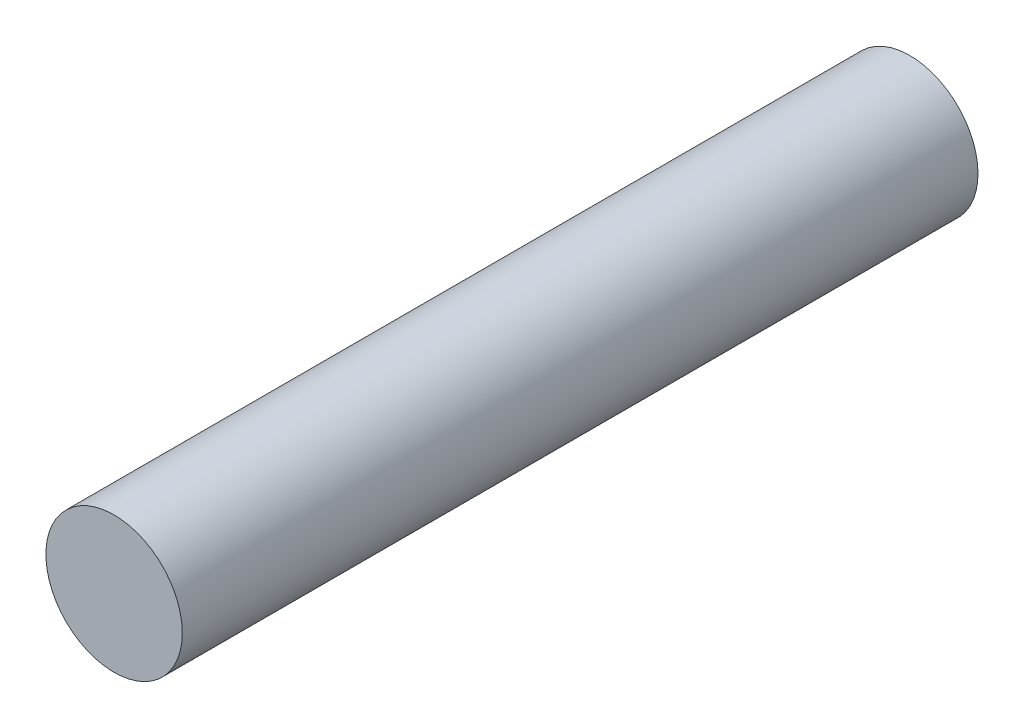
ISO-10303-21;
HEADER;
FILE_DESCRIPTION(('STEP AP214'),'2;1');
FILE_NAME('part.step','',(''),(''),'','','');
FILE_SCHEMA(('AUTOMOTIVE_DESIGN { 1 0 10303 214 1 1 1 1 }'));
ENDSEC;
DATA;
#1=APPLICATION_CONTEXT('core data for automotive mechanical design processes');
#2=APPLICATION_PROTOCOL_DEFINITION('international standard','automotive_design',2000,#1);
#3=PRODUCT_CONTEXT('',#1,'mechanical');
#4=PRODUCT('Part','Part','',(#3));
#5=PRODUCT_RELATED_PRODUCT_CATEGORY('part','',(#4));
#6=PRODUCT_DEFINITION_FORMATION('','',#4);
#7=PRODUCT_DEFINITION_CONTEXT('part definition',#1,'design');
#8=PRODUCT_DEFINITION('design','',#6,#7);
#9=PRODUCT_DEFINITION_SHAPE('','',#8);
#10=(LENGTH_UNIT() NAMED_UNIT(*) SI_UNIT(.MILLI.,.METRE.));
#11=(NAMED_UNIT(*) PLANE_ANGLE_UNIT() SI_UNIT($,.RADIAN.));
#12=(NAMED_UNIT(*) SI_UNIT($,.STERADIAN.) SOLID_ANGLE_UNIT());
#13=UNCERTAINTY_MEASURE_WITH_UNIT(LENGTH_MEASURE(1.E-05),#10,'distance_accuracy_value','');
#14=(GEOMETRIC_REPRESENTATION_CONTEXT(3) GLOBAL_UNCERTAINTY_ASSIGNED_CONTEXT((#13)) GLOBAL_UNIT_ASSIGNED_CONTEXT((#10,
#11,#12)) REPRESENTATION_CONTEXT('',''));
#15=CARTESIAN_POINT('',(0.,0.,0.));
#16=DIRECTION('',(0.,0.,1.));
#17=DIRECTION('',(1.,0.,0.));
#18=AXIS2_PLACEMENT_3D('',#15,#16,#17);
#19=CARTESIAN_POINT('',(0.,0.,35.));
#20=DIRECTION('',(0.,0.,-1.));
#21=DIRECTION('',(-1.,0.,0.));
#22=AXIS2_PLACEMENT_3D('',#19,#20,#21);
#23=CYLINDRICAL_SURFACE('',#22,3.);
#24=CARTESIAN_POINT('',(0.,0.,35.));
#25=DIRECTION('',(0.,0.,1.));
#26=DIRECTION('',(1.,0.,0.));
#27=AXIS2_PLACEMENT_3D('',#24,#25,#26);
#28=CIRCLE('',#27,3.);
#29=CARTESIAN_POINT('',(3.,0.,35.));
#30=VERTEX_POINT('',#29);
#31=EDGE_CURVE('E10',#30,#30,#28,.T.);
#32=ORIENTED_EDGE('',*,*,#31,.F.);
#33=EDGE_LOOP('',(#32));
#34=FACE_BOUND('',#33,.T.);
#35=CARTESIAN_POINT('',(0.,0.,0.));
#36=DIRECTION('',(0.,0.,1.));
#37=DIRECTION('',(1.,0.,0.));
#38=AXIS2_PLACEMENT_3D('',#35,#36,#37);
#39=CIRCLE('',#38,3.);
#40=CARTESIAN_POINT('',(3.,0.,0.));
#41=VERTEX_POINT('',#40);
#42=EDGE_CURVE('E34',#41,#41,#39,.T.);
#43=ORIENTED_EDGE('',*,*,#42,.T.);
#44=EDGE_LOOP('',(#43));
#45=FACE_BOUND('',#44,.T.);
#46=ADVANCED_FACE('F31',(#34,#45),#23,.T.);
#47=CARTESIAN_POINT('',(0.,0.,35.));
#48=DIRECTION('',(0.,0.,1.));
#49=DIRECTION('',(1.,0.,0.));
#50=AXIS2_PLACEMENT_3D('',#47,#48,#49);
#51=PLANE('',#50);
#52=ORIENTED_EDGE('',*,*,#31,.T.);
#53=EDGE_LOOP('',(#52));
#54=FACE_BOUND('',#53,.T.);
#55=ADVANCED_FACE('F46',(#54),#51,.T.);
#56=CARTESIAN_POINT('',(0.,0.,0.));
#57=DIRECTION('',(0.,0.,1.));
#58=DIRECTION('',(1.,0.,0.));
#59=AXIS2_PLACEMENT_3D('',#56,#57,#58);
#60=PLANE('',#59);
#61=ORIENTED_EDGE('',*,*,#42,.F.);
#62=EDGE_LOOP('',(#61));
#63=FACE_BOUND('',#62,.T.);
#64=ADVANCED_FACE('F44',(#63),#60,.F.);
#65=CLOSED_SHELL('',(#46,#55,#64));
#66=MANIFOLD_SOLID_BREP('B2',#65);
#67=ADVANCED_BREP_SHAPE_REPRESENTATION('',(#18,#66),#14);
#68=SHAPE_DEFINITION_REPRESENTATION(#9,#67);
ENDSEC;
END-ISO-10303-21;
